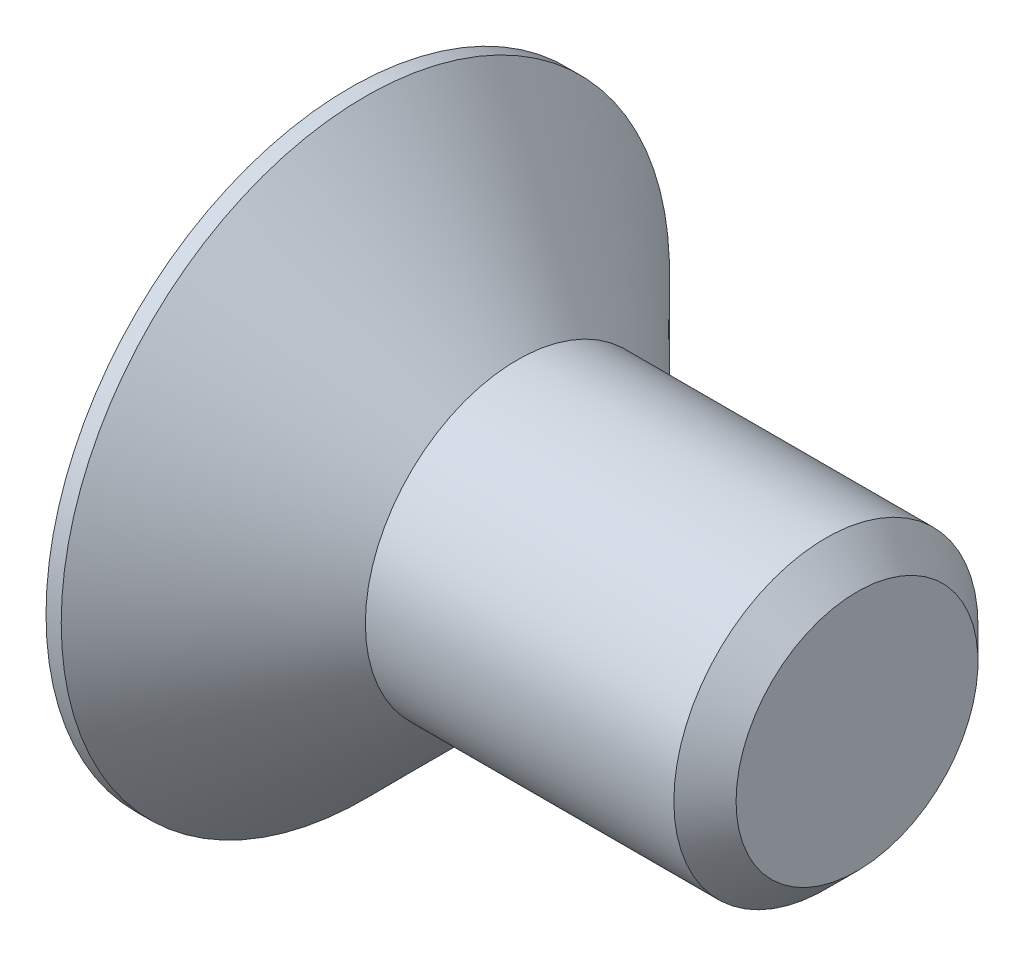
ISO-10303-21;
HEADER;
FILE_DESCRIPTION(('STEP AP214'),'2;1');
FILE_NAME('part.step','',(''),(''),'','','');
FILE_SCHEMA(('AUTOMOTIVE_DESIGN { 1 0 10303 214 1 1 1 1 }'));
ENDSEC;
DATA;
#1=APPLICATION_CONTEXT('core data for automotive mechanical design processes');
#2=APPLICATION_PROTOCOL_DEFINITION('international standard','automotive_design',2000,#1);
#3=PRODUCT_CONTEXT('',#1,'mechanical');
#4=PRODUCT('Part','Part','',(#3));
#5=PRODUCT_RELATED_PRODUCT_CATEGORY('part','',(#4));
#6=PRODUCT_DEFINITION_FORMATION('','',#4);
#7=PRODUCT_DEFINITION_CONTEXT('part definition',#1,'design');
#8=PRODUCT_DEFINITION('design','',#6,#7);
#9=PRODUCT_DEFINITION_SHAPE('','',#8);
#10=(LENGTH_UNIT() NAMED_UNIT(*) SI_UNIT(.MILLI.,.METRE.));
#11=(NAMED_UNIT(*) PLANE_ANGLE_UNIT() SI_UNIT($,.RADIAN.));
#12=(NAMED_UNIT(*) SI_UNIT($,.STERADIAN.) SOLID_ANGLE_UNIT());
#13=UNCERTAINTY_MEASURE_WITH_UNIT(LENGTH_MEASURE(1.E-05),#10,'distance_accuracy_value','');
#14=(GEOMETRIC_REPRESENTATION_CONTEXT(3) GLOBAL_UNCERTAINTY_ASSIGNED_CONTEXT((#13)) GLOBAL_UNIT_ASSIGNED_CONTEXT((#10,
#11,#12)) REPRESENTATION_CONTEXT('',''));
#15=CARTESIAN_POINT('',(0.,0.,0.));
#16=DIRECTION('',(0.,0.,1.));
#17=DIRECTION('',(1.,0.,0.));
#18=AXIS2_PLACEMENT_3D('',#15,#16,#17);
#19=CARTESIAN_POINT('',(2.64,0.,0.));
#20=DIRECTION('',(1.,0.,0.));
#21=DIRECTION('',(0.,0.,-1.));
#22=AXIS2_PLACEMENT_3D('',#19,#20,#21);
#23=PLANE('',#22);
#24=DIRECTION('',(0.,-0.500000000000003,-0.866025403784437));
#25=VECTOR('',#24,1.);
#26=CARTESIAN_POINT('',(2.64,-1.15470053837925,2.));
#27=LINE('',#26,#25);
#28=CARTESIAN_POINT('',(2.64,-1.15470053837925,2.));
#29=VERTEX_POINT('',#28);
#30=CARTESIAN_POINT('',(2.64000000002108,-1.73205080757301,1.00000000000239));
#31=VERTEX_POINT('',#30);
#32=EDGE_CURVE('E93',#29,#31,#27,.T.);
#33=ORIENTED_EDGE('',*,*,#32,.F.);
#34=DIRECTION('',(0.,1.,0.));
#35=VECTOR('',#34,1.);
#36=CARTESIAN_POINT('',(2.64,0.,2.));
#37=LINE('',#36,#35);
#38=CARTESIAN_POINT('',(2.64000000002108,0.,2.00000000000477));
#39=VERTEX_POINT('',#38);
#40=EDGE_CURVE('E89',#39,#29,#37,.F.);
#41=ORIENTED_EDGE('',*,*,#40,.F.);
#42=CARTESIAN_POINT('',(2.64000000004216,0.,0.));
#43=DIRECTION('',(-1.,0.,0.));
#44=DIRECTION('',(0.,0.,1.));
#45=AXIS2_PLACEMENT_3D('',#42,#43,#44);
#46=CIRCLE('',#45,2.00000000000955);
#47=EDGE_CURVE('E20',#39,#31,#46,.F.);
#48=ORIENTED_EDGE('',*,*,#47,.T.);
#49=EDGE_LOOP('',(#33,#41,#48));
#50=FACE_BOUND('',#49,.T.);
#51=ADVANCED_FACE('F17',(#50),#23,.F.);
#52=CARTESIAN_POINT('',(2.64,0.,0.));
#53=DIRECTION('',(1.,0.,0.));
#54=DIRECTION('',(0.,0.,-1.));
#55=AXIS2_PLACEMENT_3D('',#52,#53,#54);
#56=PLANE('',#55);
#57=DIRECTION('',(0.,0.499999999999996,-0.866025403784441));
#58=VECTOR('',#57,1.);
#59=CARTESIAN_POINT('',(2.64,-2.3094010767585,0.));
#60=LINE('',#59,#58);
#61=CARTESIAN_POINT('',(2.64,-2.3094010767585,0.));
#62=VERTEX_POINT('',#61);
#63=CARTESIAN_POINT('',(2.64000000002108,-1.73205080757301,-1.00000000000239));
#64=VERTEX_POINT('',#63);
#65=EDGE_CURVE('E151',#62,#64,#60,.T.);
#66=ORIENTED_EDGE('',*,*,#65,.F.);
#67=DIRECTION('',(0.,-0.499999999999996,-0.866025403784441));
#68=VECTOR('',#67,1.);
#69=CARTESIAN_POINT('',(2.64,-1.73205080756888,1.));
#70=LINE('',#69,#68);
#71=EDGE_CURVE('E155',#31,#62,#70,.T.);
#72=ORIENTED_EDGE('',*,*,#71,.F.);
#73=CARTESIAN_POINT('',(2.64000000004216,0.,0.));
#74=DIRECTION('',(-1.,0.,0.));
#75=DIRECTION('',(0.,0.,1.));
#76=AXIS2_PLACEMENT_3D('',#73,#74,#75);
#77=CIRCLE('',#76,2.00000000000955);
#78=EDGE_CURVE('E109',#31,#64,#77,.F.);
#79=ORIENTED_EDGE('',*,*,#78,.T.);
#80=EDGE_LOOP('',(#66,#72,#79));
#81=FACE_BOUND('',#80,.T.);
#82=ADVANCED_FACE('F206',(#81),#56,.F.);
#83=CARTESIAN_POINT('',(2.64,0.,0.));
#84=DIRECTION('',(1.,0.,0.));
#85=DIRECTION('',(0.,0.,-1.));
#86=AXIS2_PLACEMENT_3D('',#83,#84,#85);
#87=PLANE('',#86);
#88=DIRECTION('',(0.,1.,0.));
#89=VECTOR('',#88,1.);
#90=CARTESIAN_POINT('',(2.64,0.,-2.));
#91=LINE('',#90,#89);
#92=CARTESIAN_POINT('',(2.64,-1.15470053837925,-2.));
#93=VERTEX_POINT('',#92);
#94=CARTESIAN_POINT('',(2.64000000002108,0.,-2.00000000000477));
#95=VERTEX_POINT('',#94);
#96=EDGE_CURVE('E143',#93,#95,#91,.T.);
#97=ORIENTED_EDGE('',*,*,#96,.F.);
#98=DIRECTION('',(0.,0.500000000000003,-0.866025403784437));
#99=VECTOR('',#98,1.);
#100=CARTESIAN_POINT('',(2.64,-1.73205080756888,-1.));
#101=LINE('',#100,#99);
#102=EDGE_CURVE('E147',#64,#93,#101,.T.);
#103=ORIENTED_EDGE('',*,*,#102,.F.);
#104=CARTESIAN_POINT('',(2.64000000004216,0.,0.));
#105=DIRECTION('',(-1.,0.,0.));
#106=DIRECTION('',(0.,0.,1.));
#107=AXIS2_PLACEMENT_3D('',#104,#105,#106);
#108=CIRCLE('',#107,2.00000000000955);
#109=EDGE_CURVE('E201',#64,#95,#108,.F.);
#110=ORIENTED_EDGE('',*,*,#109,.T.);
#111=EDGE_LOOP('',(#97,#103,#110));
#112=FACE_BOUND('',#111,.T.);
#113=ADVANCED_FACE('F209',(#112),#87,.F.);
#114=CARTESIAN_POINT('',(2.64,0.,0.));
#115=DIRECTION('',(1.,0.,0.));
#116=DIRECTION('',(0.,0.,-1.));
#117=AXIS2_PLACEMENT_3D('',#114,#115,#116);
#118=PLANE('',#117);
#119=DIRECTION('',(0.,0.500000000000003,0.866025403784437));
#120=VECTOR('',#119,1.);
#121=CARTESIAN_POINT('',(2.64,1.15470053837925,-2.));
#122=LINE('',#121,#120);
#123=CARTESIAN_POINT('',(2.64,1.15470053837925,-2.));
#124=VERTEX_POINT('',#123);
#125=CARTESIAN_POINT('',(2.64000000002108,1.73205080757301,-1.00000000000239));
#126=VERTEX_POINT('',#125);
#127=EDGE_CURVE('E135',#124,#126,#122,.T.);
#128=ORIENTED_EDGE('',*,*,#127,.F.);
#129=DIRECTION('',(0.,1.,0.));
#130=VECTOR('',#129,1.);
#131=CARTESIAN_POINT('',(2.64,0.,-2.));
#132=LINE('',#131,#130);
#133=EDGE_CURVE('E139',#95,#124,#132,.T.);
#134=ORIENTED_EDGE('',*,*,#133,.F.);
#135=CARTESIAN_POINT('',(2.64000000004216,0.,0.));
#136=DIRECTION('',(-1.,0.,0.));
#137=DIRECTION('',(0.,0.,1.));
#138=AXIS2_PLACEMENT_3D('',#135,#136,#137);
#139=CIRCLE('',#138,2.00000000000955);
#140=EDGE_CURVE('E198',#95,#126,#139,.F.);
#141=ORIENTED_EDGE('',*,*,#140,.T.);
#142=EDGE_LOOP('',(#128,#134,#141));
#143=FACE_BOUND('',#142,.T.);
#144=ADVANCED_FACE('F215',(#143),#118,.F.);
#145=CARTESIAN_POINT('',(2.64,0.,0.));
#146=DIRECTION('',(1.,0.,0.));
#147=DIRECTION('',(0.,0.,-1.));
#148=AXIS2_PLACEMENT_3D('',#145,#146,#147);
#149=PLANE('',#148);
#150=CARTESIAN_POINT('',(2.64000000004216,0.,0.));
#151=DIRECTION('',(-1.,0.,0.));
#152=DIRECTION('',(0.,0.,1.));
#153=AXIS2_PLACEMENT_3D('',#150,#151,#152);
#154=CIRCLE('',#153,2.00000000000955);
#155=CARTESIAN_POINT('',(2.64000000002108,1.73205080757301,1.00000000000239));
#156=VERTEX_POINT('',#155);
#157=EDGE_CURVE('E117',#126,#156,#154,.F.);
#158=ORIENTED_EDGE('',*,*,#157,.T.);
#159=DIRECTION('',(0.,-0.499999999999996,0.866025403784441));
#160=VECTOR('',#159,1.);
#161=CARTESIAN_POINT('',(2.64,2.3094010767585,0.));
#162=LINE('',#161,#160);
#163=CARTESIAN_POINT('',(2.64,2.3094010767585,0.));
#164=VERTEX_POINT('',#163);
#165=EDGE_CURVE('E131',#164,#156,#162,.T.);
#166=ORIENTED_EDGE('',*,*,#165,.F.);
#167=DIRECTION('',(0.,0.499999999999996,0.866025403784441));
#168=VECTOR('',#167,1.);
#169=CARTESIAN_POINT('',(2.64,1.73205080756888,-1.));
#170=LINE('',#169,#168);
#171=EDGE_CURVE('E110',#126,#164,#170,.T.);
#172=ORIENTED_EDGE('',*,*,#171,.F.);
#173=EDGE_LOOP('',(#158,#166,#172));
#174=FACE_BOUND('',#173,.T.);
#175=ADVANCED_FACE('F218',(#174),#149,.F.);
#176=CARTESIAN_POINT('',(2.64000000004216,0.,0.));
#177=DIRECTION('',(-1.,0.,0.));
#178=DIRECTION('',(0.,0.,1.));
#179=AXIS2_PLACEMENT_3D('',#176,#177,#178);
#180=CONICAL_SURFACE('',#179,2.00000000000955,1.30899693893931);
#181=CARTESIAN_POINT('',(3.17589838493859,0.,-1.13686837721616E-10));
#182=VERTEX_POINT('',#181);
#183=VERTEX_LOOP('',#182);
#184=FACE_BOUND('',#183,.T.);
#185=ORIENTED_EDGE('',*,*,#140,.F.);
#186=ORIENTED_EDGE('',*,*,#109,.F.);
#187=ORIENTED_EDGE('',*,*,#78,.F.);
#188=ORIENTED_EDGE('',*,*,#47,.F.);
#189=CARTESIAN_POINT('',(2.64000000004216,0.,0.));
#190=DIRECTION('',(-1.,0.,0.));
#191=DIRECTION('',(0.,0.,1.));
#192=AXIS2_PLACEMENT_3D('',#189,#190,#191);
#193=CIRCLE('',#192,2.00000000000955);
#194=EDGE_CURVE('E105',#39,#156,#193,.T.);
#195=ORIENTED_EDGE('',*,*,#194,.T.);
#196=ORIENTED_EDGE('',*,*,#157,.F.);
#197=EDGE_LOOP('',(#185,#186,#187,#188,#195,#196));
#198=FACE_BOUND('',#197,.T.);
#199=ADVANCED_FACE('F103',(#184,#198),#180,.F.);
#200=CARTESIAN_POINT('',(2.64,0.,0.));
#201=DIRECTION('',(1.,0.,0.));
#202=DIRECTION('',(0.,0.,-1.));
#203=AXIS2_PLACEMENT_3D('',#200,#201,#202);
#204=PLANE('',#203);
#205=DIRECTION('',(0.,1.,0.));
#206=VECTOR('',#205,1.);
#207=CARTESIAN_POINT('',(2.64,1.15470053837925,2.));
#208=LINE('',#207,#206);
#209=CARTESIAN_POINT('',(2.64,1.15470053837925,2.));
#210=VERTEX_POINT('',#209);
#211=EDGE_CURVE('E113',#210,#39,#208,.F.);
#212=ORIENTED_EDGE('',*,*,#211,.F.);
#213=DIRECTION('',(0.,0.5,-0.866025403784439));
#214=VECTOR('',#213,1.);
#215=CARTESIAN_POINT('',(2.64,2.3094010767585,0.));
#216=LINE('',#215,#214);
#217=EDGE_CURVE('E116',#156,#210,#216,.F.);
#218=ORIENTED_EDGE('',*,*,#217,.F.);
#219=ORIENTED_EDGE('',*,*,#194,.F.);
#220=EDGE_LOOP('',(#212,#218,#219));
#221=FACE_BOUND('',#220,.T.);
#222=ADVANCED_FACE('F112',(#221),#204,.F.);
#223=CARTESIAN_POINT('',(10.,2.3865,0.));
#224=DIRECTION('',(-1.,0.,0.));
#225=DIRECTION('',(0.,0.,1.));
#226=AXIS2_PLACEMENT_3D('',#223,#224,#225);
#227=PLANE('',#226);
#228=CARTESIAN_POINT('',(9.99999999993406,0.,0.));
#229=DIRECTION('',(-1.,0.,0.));
#230=DIRECTION('',(0.,0.,1.));
#231=AXIS2_PLACEMENT_3D('',#228,#229,#230);
#232=CIRCLE('',#231,2.38650000000007);
#233=CARTESIAN_POINT('',(9.99999999993406,0.,2.38650000000007));
#234=VERTEX_POINT('',#233);
#235=EDGE_CURVE('E183',#234,#234,#232,.T.);
#236=ORIENTED_EDGE('',*,*,#235,.F.);
#237=EDGE_LOOP('',(#236));
#238=FACE_BOUND('',#237,.T.);
#239=ADVANCED_FACE('F271',(#238),#227,.F.);
#240=CARTESIAN_POINT('',(2.64,1.15470053837925,2.));
#241=DIRECTION('',(0.,0.,-1.));
#242=DIRECTION('',(-1.,0.,0.));
#243=AXIS2_PLACEMENT_3D('',#240,#241,#242);
#244=PLANE('',#243);
#245=ORIENTED_EDGE('',*,*,#40,.T.);
#246=DIRECTION('',(1.,0.,0.));
#247=VECTOR('',#246,1.);
#248=CARTESIAN_POINT('',(2.64,-1.15470053837925,2.));
#249=LINE('',#248,#247);
#250=CARTESIAN_POINT('',(0.,-1.15470053837925,2.));
#251=VERTEX_POINT('',#250);
#252=EDGE_CURVE('E178',#251,#29,#249,.T.);
#253=ORIENTED_EDGE('',*,*,#252,.F.);
#254=DIRECTION('',(0.,1.,0.));
#255=VECTOR('',#254,1.);
#256=CARTESIAN_POINT('',(0.,0.,2.));
#257=LINE('',#256,#255);
#258=CARTESIAN_POINT('',(0.,1.15470053837925,2.));
#259=VERTEX_POINT('',#258);
#260=EDGE_CURVE('E194',#251,#259,#257,.T.);
#261=ORIENTED_EDGE('',*,*,#260,.T.);
#262=DIRECTION('',(1.,0.,0.));
#263=VECTOR('',#262,1.);
#264=CARTESIAN_POINT('',(2.64,1.15470053837925,2.));
#265=LINE('',#264,#263);
#266=EDGE_CURVE('E121',#210,#259,#265,.F.);
#267=ORIENTED_EDGE('',*,*,#266,.F.);
#268=ORIENTED_EDGE('',*,*,#211,.T.);
#269=EDGE_LOOP('',(#245,#253,#261,#267,#268));
#270=FACE_BOUND('',#269,.T.);
#271=ADVANCED_FACE('F119',(#270),#244,.T.);
#272=CARTESIAN_POINT('',(2.64,2.3094010767585,0.));
#273=DIRECTION('',(0.,-0.866025403784439,-0.5));
#274=DIRECTION('',(0.,0.5,-0.866025403784439));
#275=AXIS2_PLACEMENT_3D('',#272,#273,#274);
#276=PLANE('',#275);
#277=ORIENTED_EDGE('',*,*,#217,.T.);
#278=ORIENTED_EDGE('',*,*,#266,.T.);
#279=DIRECTION('',(0.,0.499999999999999,-0.866025403784439));
#280=VECTOR('',#279,1.);
#281=CARTESIAN_POINT('',(0.,1.15470053837925,2.));
#282=LINE('',#281,#280);
#283=CARTESIAN_POINT('',(0.,2.3094010767585,0.));
#284=VERTEX_POINT('',#283);
#285=EDGE_CURVE('E227',#259,#284,#282,.T.);
#286=ORIENTED_EDGE('',*,*,#285,.T.);
#287=DIRECTION('',(1.,0.,0.));
#288=VECTOR('',#287,1.);
#289=CARTESIAN_POINT('',(2.64,2.3094010767585,0.));
#290=LINE('',#289,#288);
#291=EDGE_CURVE('E166',#164,#284,#290,.F.);
#292=ORIENTED_EDGE('',*,*,#291,.F.);
#293=ORIENTED_EDGE('',*,*,#165,.T.);
#294=EDGE_LOOP('',(#277,#278,#286,#292,#293));
#295=FACE_BOUND('',#294,.T.);
#296=ADVANCED_FACE('F225',(#295),#276,.T.);
#297=CARTESIAN_POINT('',(2.64,1.15470053837925,-2.));
#298=DIRECTION('',(0.,-0.866025403784439,0.5));
#299=DIRECTION('',(0.,-0.5,-0.866025403784439));
#300=AXIS2_PLACEMENT_3D('',#297,#298,#299);
#301=PLANE('',#300);
#302=ORIENTED_EDGE('',*,*,#171,.T.);
#303=ORIENTED_EDGE('',*,*,#291,.T.);
#304=DIRECTION('',(0.,-0.499999999999999,-0.866025403784439));
#305=VECTOR('',#304,1.);
#306=CARTESIAN_POINT('',(0.,2.3094010767585,0.));
#307=LINE('',#306,#305);
#308=CARTESIAN_POINT('',(0.,1.15470053837925,-2.));
#309=VERTEX_POINT('',#308);
#310=EDGE_CURVE('E230',#284,#309,#307,.T.);
#311=ORIENTED_EDGE('',*,*,#310,.T.);
#312=DIRECTION('',(1.,0.,0.));
#313=VECTOR('',#312,1.);
#314=CARTESIAN_POINT('',(2.64,1.15470053837925,-2.));
#315=LINE('',#314,#313);
#316=EDGE_CURVE('E169',#124,#309,#315,.F.);
#317=ORIENTED_EDGE('',*,*,#316,.F.);
#318=ORIENTED_EDGE('',*,*,#127,.T.);
#319=EDGE_LOOP('',(#302,#303,#311,#317,#318));
#320=FACE_BOUND('',#319,.T.);
#321=ADVANCED_FACE('F221',(#320),#301,.T.);
#322=CARTESIAN_POINT('',(2.64,-1.15470053837925,-2.));
#323=DIRECTION('',(0.,0.,1.));
#324=DIRECTION('',(1.,0.,0.));
#325=AXIS2_PLACEMENT_3D('',#322,#323,#324);
#326=PLANE('',#325);
#327=ORIENTED_EDGE('',*,*,#133,.T.);
#328=ORIENTED_EDGE('',*,*,#316,.T.);
#329=DIRECTION('',(0.,1.,0.));
#330=VECTOR('',#329,1.);
#331=CARTESIAN_POINT('',(0.,0.,-2.));
#332=LINE('',#331,#330);
#333=CARTESIAN_POINT('',(0.,-1.15470053837925,-2.));
#334=VERTEX_POINT('',#333);
#335=EDGE_CURVE('E232',#309,#334,#332,.F.);
#336=ORIENTED_EDGE('',*,*,#335,.T.);
#337=DIRECTION('',(1.,0.,0.));
#338=VECTOR('',#337,1.);
#339=CARTESIAN_POINT('',(2.64,-1.15470053837925,-2.));
#340=LINE('',#339,#338);
#341=EDGE_CURVE('E174',#93,#334,#340,.F.);
#342=ORIENTED_EDGE('',*,*,#341,.F.);
#343=ORIENTED_EDGE('',*,*,#96,.T.);
#344=EDGE_LOOP('',(#327,#328,#336,#342,#343));
#345=FACE_BOUND('',#344,.T.);
#346=ADVANCED_FACE('F298',(#345),#326,.T.);
#347=CARTESIAN_POINT('',(2.64,-2.3094010767585,0.));
#348=DIRECTION('',(0.,0.866025403784439,0.5));
#349=DIRECTION('',(0.,-0.5,0.866025403784439));
#350=AXIS2_PLACEMENT_3D('',#347,#348,#349);
#351=PLANE('',#350);
#352=ORIENTED_EDGE('',*,*,#102,.T.);
#353=ORIENTED_EDGE('',*,*,#341,.T.);
#354=DIRECTION('',(0.,-0.499999999999999,0.866025403784439));
#355=VECTOR('',#354,1.);
#356=CARTESIAN_POINT('',(0.,-1.15470053837925,-2.));
#357=LINE('',#356,#355);
#358=CARTESIAN_POINT('',(0.,-2.3094010767585,0.));
#359=VERTEX_POINT('',#358);
#360=EDGE_CURVE('E35',#334,#359,#357,.T.);
#361=ORIENTED_EDGE('',*,*,#360,.T.);
#362=DIRECTION('',(1.,0.,0.));
#363=VECTOR('',#362,1.);
#364=CARTESIAN_POINT('',(2.64,-2.3094010767585,0.));
#365=LINE('',#364,#363);
#366=EDGE_CURVE('E181',#62,#359,#365,.F.);
#367=ORIENTED_EDGE('',*,*,#366,.F.);
#368=ORIENTED_EDGE('',*,*,#65,.T.);
#369=EDGE_LOOP('',(#352,#353,#361,#367,#368));
#370=FACE_BOUND('',#369,.T.);
#371=ADVANCED_FACE('F294',(#370),#351,.T.);
#372=CARTESIAN_POINT('',(2.64,-1.15470053837925,2.));
#373=DIRECTION('',(0.,0.866025403784439,-0.5));
#374=DIRECTION('',(0.,0.5,0.866025403784439));
#375=AXIS2_PLACEMENT_3D('',#372,#373,#374);
#376=PLANE('',#375);
#377=ORIENTED_EDGE('',*,*,#71,.T.);
#378=ORIENTED_EDGE('',*,*,#366,.T.);
#379=DIRECTION('',(0.,0.499999999999999,0.866025403784439));
#380=VECTOR('',#379,1.);
#381=CARTESIAN_POINT('',(0.,-2.3094010767585,0.));
#382=LINE('',#381,#380);
#383=EDGE_CURVE('E240',#359,#251,#382,.T.);
#384=ORIENTED_EDGE('',*,*,#383,.T.);
#385=ORIENTED_EDGE('',*,*,#252,.T.);
#386=ORIENTED_EDGE('',*,*,#32,.T.);
#387=EDGE_LOOP('',(#377,#378,#384,#385,#386));
#388=FACE_BOUND('',#387,.T.);
#389=ADVANCED_FACE('F267',(#388),#376,.T.);
#390=CARTESIAN_POINT('',(9.38650000000507,0.,0.));
#391=DIRECTION('',(-1.,0.,0.));
#392=DIRECTION('',(0.,0.,1.));
#393=AXIS2_PLACEMENT_3D('',#390,#391,#392);
#394=CONICAL_SURFACE('',#393,2.9999999999859,0.785398163443775);
#395=CARTESIAN_POINT('',(9.3865,0.,0.));
#396=DIRECTION('',(-1.,0.,0.));
#397=DIRECTION('',(0.,0.,1.));
#398=AXIS2_PLACEMENT_3D('',#395,#396,#397);
#399=CIRCLE('',#398,3.);
#400=CARTESIAN_POINT('',(9.3865,0.,3.));
#401=VERTEX_POINT('',#400);
#402=EDGE_CURVE('E192',#401,#401,#399,.T.);
#403=ORIENTED_EDGE('',*,*,#402,.F.);
#404=EDGE_LOOP('',(#403));
#405=FACE_BOUND('',#404,.T.);
#406=ORIENTED_EDGE('',*,*,#235,.T.);
#407=EDGE_LOOP('',(#406));
#408=FACE_BOUND('',#407,.T.);
#409=ADVANCED_FACE('F264',(#405,#408),#394,.T.);
#410=CARTESIAN_POINT('',(0.,0.,0.));
#411=DIRECTION('',(1.,0.,0.));
#412=DIRECTION('',(0.,0.,-1.));
#413=AXIS2_PLACEMENT_3D('',#410,#411,#412);
#414=PLANE('',#413);
#415=ORIENTED_EDGE('',*,*,#360,.F.);
#416=ORIENTED_EDGE('',*,*,#335,.F.);
#417=ORIENTED_EDGE('',*,*,#310,.F.);
#418=ORIENTED_EDGE('',*,*,#285,.F.);
#419=ORIENTED_EDGE('',*,*,#260,.F.);
#420=ORIENTED_EDGE('',*,*,#383,.F.);
#421=EDGE_LOOP('',(#415,#416,#417,#418,#419,#420));
#422=FACE_BOUND('',#421,.T.);
#423=CARTESIAN_POINT('',(0.,0.,0.));
#424=DIRECTION('',(-1.,0.,0.));
#425=DIRECTION('',(0.,0.,1.));
#426=AXIS2_PLACEMENT_3D('',#423,#424,#425);
#427=CIRCLE('',#426,6.);
#428=CARTESIAN_POINT('',(0.,0.,6.));
#429=VERTEX_POINT('',#428);
#430=EDGE_CURVE('E189',#429,#429,#427,.F.);
#431=ORIENTED_EDGE('',*,*,#430,.F.);
#432=EDGE_LOOP('',(#431));
#433=FACE_BOUND('',#432,.T.);
#434=ADVANCED_FACE('F260',(#422,#433),#414,.F.);
#435=CARTESIAN_POINT('',(10.,0.,0.));
#436=DIRECTION('',(-1.,0.,0.));
#437=DIRECTION('',(0.,0.,1.));
#438=AXIS2_PLACEMENT_3D('',#435,#436,#437);
#439=CYLINDRICAL_SURFACE('',#438,3.);
#440=CARTESIAN_POINT('',(3.29999999996744,0.,0.));
#441=DIRECTION('',(-1.,0.,0.));
#442=DIRECTION('',(0.,0.,1.));
#443=AXIS2_PLACEMENT_3D('',#440,#441,#442);
#444=CIRCLE('',#443,2.99999999987222);
#445=CARTESIAN_POINT('',(3.29999999996744,0.,2.99999999987222));
#446=VERTEX_POINT('',#445);
#447=EDGE_CURVE('E26',#446,#446,#444,.T.);
#448=ORIENTED_EDGE('',*,*,#447,.F.);
#449=EDGE_LOOP('',(#448));
#450=FACE_BOUND('',#449,.T.);
#451=ORIENTED_EDGE('',*,*,#402,.T.);
#452=EDGE_LOOP('',(#451));
#453=FACE_BOUND('',#452,.T.);
#454=ADVANCED_FACE('F256',(#450,#453),#439,.T.);
#455=CARTESIAN_POINT('',(10.,0.,0.));
#456=DIRECTION('',(-1.,0.,0.));
#457=DIRECTION('',(0.,0.,1.));
#458=AXIS2_PLACEMENT_3D('',#455,#456,#457);
#459=CYLINDRICAL_SURFACE('',#458,6.);
#460=ORIENTED_EDGE('',*,*,#430,.T.);
#461=EDGE_LOOP('',(#460));
#462=FACE_BOUND('',#461,.T.);
#463=CARTESIAN_POINT('',(0.299999999924694,0.,0.));
#464=DIRECTION('',(-1.,0.,0.));
#465=DIRECTION('',(0.,0.,1.));
#466=AXIS2_PLACEMENT_3D('',#463,#464,#465);
#467=CIRCLE('',#466,5.99999999991496);
#468=CARTESIAN_POINT('',(0.299999999924694,0.,5.99999999991496));
#469=VERTEX_POINT('',#468);
#470=EDGE_CURVE('E11',#469,#469,#467,.F.);
#471=ORIENTED_EDGE('',*,*,#470,.F.);
#472=EDGE_LOOP('',(#471));
#473=FACE_BOUND('',#472,.T.);
#474=ADVANCED_FACE('F259',(#462,#473),#459,.T.);
#475=CARTESIAN_POINT('',(0.300000000038381,0.,0.));
#476=DIRECTION('',(-1.,0.,0.));
#477=DIRECTION('',(0.,0.,1.));
#478=AXIS2_PLACEMENT_3D('',#475,#476,#477);
#479=CONICAL_SURFACE('',#478,5.99999999985812,0.785398163397448);
#480=ORIENTED_EDGE('',*,*,#470,.T.);
#481=EDGE_LOOP('',(#480));
#482=FACE_BOUND('',#481,.T.);
#483=ORIENTED_EDGE('',*,*,#447,.T.);
#484=EDGE_LOOP('',(#483));
#485=FACE_BOUND('',#484,.T.);
#486=ADVANCED_FACE('F254',(#482,#485),#479,.T.);
#487=CLOSED_SHELL('',(#51,#82,#113,#144,#175,#199,#222,#239,#271,#296,#321,#346,#371,#389,#409,
#434,#454,#474,#486));
#488=MANIFOLD_SOLID_BREP('B1',#487);
#489=ADVANCED_BREP_SHAPE_REPRESENTATION('',(#18,#488),#14);
#490=SHAPE_DEFINITION_REPRESENTATION(#9,#489);
ENDSEC;
END-ISO-10303-21;
